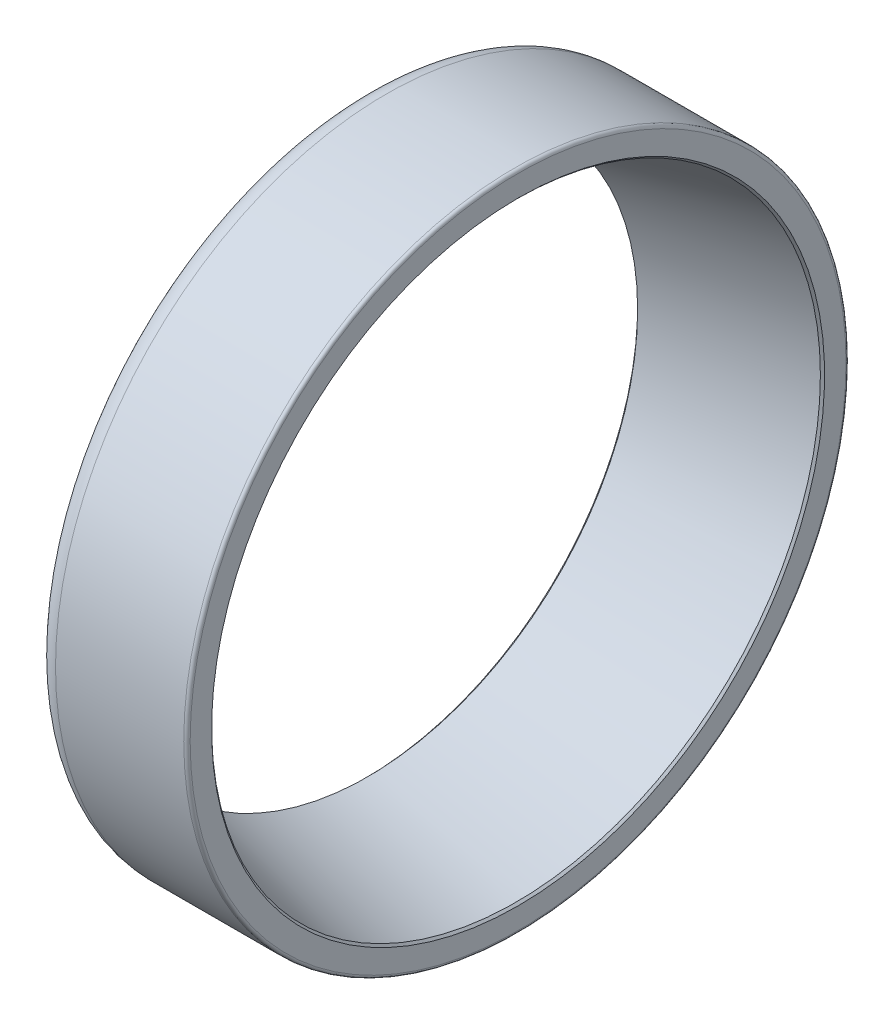
ISO-10303-21;
HEADER;
FILE_DESCRIPTION(('STEP AP214'),'2;1');
FILE_NAME('part.step','',(''),(''),'','','');
FILE_SCHEMA(('AUTOMOTIVE_DESIGN { 1 0 10303 214 1 1 1 1 }'));
ENDSEC;
DATA;
#1=APPLICATION_CONTEXT('core data for automotive mechanical design processes');
#2=APPLICATION_PROTOCOL_DEFINITION('international standard','automotive_design',2000,#1);
#3=PRODUCT_CONTEXT('',#1,'mechanical');
#4=PRODUCT('Part','Part','',(#3));
#5=PRODUCT_RELATED_PRODUCT_CATEGORY('part','',(#4));
#6=PRODUCT_DEFINITION_FORMATION('','',#4);
#7=PRODUCT_DEFINITION_CONTEXT('part definition',#1,'design');
#8=PRODUCT_DEFINITION('design','',#6,#7);
#9=PRODUCT_DEFINITION_SHAPE('','',#8);
#10=(LENGTH_UNIT() NAMED_UNIT(*) SI_UNIT(.MILLI.,.METRE.));
#11=(NAMED_UNIT(*) PLANE_ANGLE_UNIT() SI_UNIT($,.RADIAN.));
#12=(NAMED_UNIT(*) SI_UNIT($,.STERADIAN.) SOLID_ANGLE_UNIT());
#13=UNCERTAINTY_MEASURE_WITH_UNIT(LENGTH_MEASURE(1.E-05),#10,'distance_accuracy_value','');
#14=(GEOMETRIC_REPRESENTATION_CONTEXT(3) GLOBAL_UNCERTAINTY_ASSIGNED_CONTEXT((#13)) GLOBAL_UNIT_ASSIGNED_CONTEXT((#10,
#11,#12)) REPRESENTATION_CONTEXT('',''));
#15=CARTESIAN_POINT('',(0.,0.,0.));
#16=DIRECTION('',(0.,0.,1.));
#17=DIRECTION('',(1.,0.,0.));
#18=AXIS2_PLACEMENT_3D('',#15,#16,#17);
#19=CARTESIAN_POINT('',(14.2880000000003,4.44089209850063E-13,0.));
#20=DIRECTION('',(-1.,0.,0.));
#21=DIRECTION('',(0.,0.,1.));
#22=AXIS2_PLACEMENT_3D('',#19,#20,#21);
#23=CYLINDRICAL_SURFACE('',#22,30.956);
#24=CARTESIAN_POINT('',(1.99999999999978,-1.11022302462516E-13,0.));
#25=DIRECTION('',(-1.,0.,0.));
#26=DIRECTION('',(0.,0.,1.));
#27=AXIS2_PLACEMENT_3D('',#24,#25,#26);
#28=CIRCLE('',#27,30.956);
#29=CARTESIAN_POINT('',(1.99999999999977,-1.31643140832693E-13,30.956));
#30=VERTEX_POINT('',#29);
#31=EDGE_CURVE('E51',#30,#30,#28,.T.);
#32=ORIENTED_EDGE('',*,*,#31,.F.);
#33=EDGE_LOOP('',(#32));
#34=FACE_BOUND('',#33,.T.);
#35=CARTESIAN_POINT('',(13.9879999999998,0.,0.));
#36=DIRECTION('',(-1.,0.,0.));
#37=DIRECTION('',(0.,0.,1.));
#38=AXIS2_PLACEMENT_3D('',#35,#36,#37);
#39=CIRCLE('',#38,30.956);
#40=CARTESIAN_POINT('',(13.9879999999998,0.,30.956));
#41=VERTEX_POINT('',#40);
#42=EDGE_CURVE('E113',#41,#41,#39,.F.);
#43=ORIENTED_EDGE('',*,*,#42,.F.);
#44=EDGE_LOOP('',(#43));
#45=FACE_BOUND('',#44,.T.);
#46=ADVANCED_FACE('F17',(#34,#45),#23,.T.);
#47=CARTESIAN_POINT('',(13.9879999999998,0.,0.));
#48=DIRECTION('',(-1.,0.,0.));
#49=DIRECTION('',(0.,0.,1.));
#50=AXIS2_PLACEMENT_3D('',#47,#48,#49);
#51=TOROIDAL_SURFACE('',#50,30.656,0.29999999999988);
#52=ORIENTED_EDGE('',*,*,#42,.T.);
#53=EDGE_LOOP('',(#52));
#54=FACE_BOUND('',#53,.T.);
#55=CARTESIAN_POINT('',(14.2879999999996,0.,0.));
#56=DIRECTION('',(-1.,0.,0.));
#57=DIRECTION('',(0.,0.,1.));
#58=AXIS2_PLACEMENT_3D('',#55,#56,#57);
#59=CIRCLE('',#58,30.656);
#60=CARTESIAN_POINT('',(14.2879999999996,1.11022302462516E-13,30.656));
#61=VERTEX_POINT('',#60);
#62=CARTESIAN_POINT('',(14.288,0.,-30.6560000000005));
#63=VERTEX_POINT('',#62);
#64=EDGE_CURVE('E44',#61,#63,#59,.T.);
#65=ORIENTED_EDGE('',*,*,#64,.T.);
#66=CARTESIAN_POINT('',(14.2879999999996,0.,0.));
#67=DIRECTION('',(-1.,0.,0.));
#68=DIRECTION('',(0.,0.,-1.));
#69=AXIS2_PLACEMENT_3D('',#66,#67,#68);
#70=CIRCLE('',#69,30.656);
#71=EDGE_CURVE('E47',#63,#61,#70,.T.);
#72=ORIENTED_EDGE('',*,*,#71,.T.);
#73=EDGE_LOOP('',(#65,#72));
#74=FACE_BOUND('',#73,.T.);
#75=ADVANCED_FACE('F55',(#54,#74),#51,.T.);
#76=CARTESIAN_POINT('',(1.99999999999988,-1.11022302462516E-13,0.));
#77=DIRECTION('',(-1.,0.,0.));
#78=DIRECTION('',(0.,0.,1.));
#79=AXIS2_PLACEMENT_3D('',#76,#77,#78);
#80=TOROIDAL_SURFACE('',#79,28.956,2.00000000000017);
#81=CARTESIAN_POINT('',(-3.05745012640912E-13,-1.1230389124973E-13,0.));
#82=DIRECTION('',(1.,0.,0.));
#83=DIRECTION('',(0.,0.,1.));
#84=AXIS2_PLACEMENT_3D('',#81,#82,#83);
#85=CIRCLE('',#84,28.9560000000001);
#86=CARTESIAN_POINT('',(-3.33066907387547E-13,-1.11022302462516E-13,28.9559999999995));
#87=VERTEX_POINT('',#86);
#88=CARTESIAN_POINT('',(1.11022302462516E-13,-1.11022302462516E-13,-28.956));
#89=VERTEX_POINT('',#88);
#90=EDGE_CURVE('E56',#87,#89,#85,.T.);
#91=ORIENTED_EDGE('',*,*,#90,.T.);
#92=CARTESIAN_POINT('',(-3.10949183068843E-13,-1.1230389124973E-13,0.));
#93=DIRECTION('',(1.,0.,0.));
#94=DIRECTION('',(0.,0.,-1.));
#95=AXIS2_PLACEMENT_3D('',#92,#93,#94);
#96=CIRCLE('',#95,28.9560000000001);
#97=EDGE_CURVE('E35',#89,#87,#96,.T.);
#98=ORIENTED_EDGE('',*,*,#97,.T.);
#99=EDGE_LOOP('',(#91,#98));
#100=FACE_BOUND('',#99,.T.);
#101=ORIENTED_EDGE('',*,*,#31,.T.);
#102=EDGE_LOOP('',(#101));
#103=FACE_BOUND('',#102,.T.);
#104=ADVANCED_FACE('F72',(#100,#103),#80,.T.);
#105=CARTESIAN_POINT('',(14.2879999999997,28.652,0.));
#106=DIRECTION('',(-1.,0.,0.));
#107=DIRECTION('',(0.,0.,1.));
#108=AXIS2_PLACEMENT_3D('',#105,#106,#107);
#109=PLANE('',#108);
#110=CARTESIAN_POINT('',(14.2880000000003,4.44089209850063E-13,0.));
#111=DIRECTION('',(1.,0.,0.));
#112=DIRECTION('',(0.,1.,0.));
#113=AXIS2_PLACEMENT_3D('',#110,#111,#112);
#114=CIRCLE('',#113,28.652);
#115=CARTESIAN_POINT('',(14.2880000000003,28.6520000000005,0.));
#116=VERTEX_POINT('',#115);
#117=EDGE_CURVE('E97',#116,#116,#114,.F.);
#118=ORIENTED_EDGE('',*,*,#117,.T.);
#119=EDGE_LOOP('',(#118));
#120=FACE_BOUND('',#119,.T.);
#121=ORIENTED_EDGE('',*,*,#71,.F.);
#122=ORIENTED_EDGE('',*,*,#64,.F.);
#123=EDGE_LOOP('',(#121,#122));
#124=FACE_BOUND('',#123,.T.);
#125=ADVANCED_FACE('F49',(#120,#124),#109,.F.);
#126=CARTESIAN_POINT('',(-3.33066907387547E-13,28.9560000000004,0.));
#127=DIRECTION('',(1.,0.,0.));
#128=DIRECTION('',(0.,0.,-1.));
#129=AXIS2_PLACEMENT_3D('',#126,#127,#128);
#130=PLANE('',#129);
#131=ORIENTED_EDGE('',*,*,#90,.F.);
#132=ORIENTED_EDGE('',*,*,#97,.F.);
#133=EDGE_LOOP('',(#131,#132));
#134=FACE_BOUND('',#133,.T.);
#135=CARTESIAN_POINT('',(0.,0.,0.));
#136=DIRECTION('',(-1.,0.,0.));
#137=DIRECTION('',(0.,0.,1.));
#138=AXIS2_PLACEMENT_3D('',#135,#136,#137);
#139=CIRCLE('',#138,25.464);
#140=CARTESIAN_POINT('',(0.,0.,25.464));
#141=VERTEX_POINT('',#140);
#142=EDGE_CURVE('E99',#141,#141,#139,.F.);
#143=ORIENTED_EDGE('',*,*,#142,.T.);
#144=EDGE_LOOP('',(#143));
#145=FACE_BOUND('',#144,.T.);
#146=ADVANCED_FACE('F139',(#134,#145),#130,.F.);
#147=CARTESIAN_POINT('',(14.2880000000003,4.44089209850063E-13,0.));
#148=DIRECTION('',(1.,0.,0.));
#149=DIRECTION('',(0.,1.,0.));
#150=AXIS2_PLACEMENT_3D('',#147,#148,#149);
#151=CONICAL_SURFACE('',#150,28.652,0.785398163397453);
#152=ORIENTED_EDGE('',*,*,#117,.F.);
#153=EDGE_LOOP('',(#152));
#154=FACE_BOUND('',#153,.T.);
#155=CARTESIAN_POINT('',(14.092273972603,3.33066907387547E-13,-4.44089209850063E-13));
#156=DIRECTION('',(1.,0.,0.));
#157=DIRECTION('',(0.,0.,-1.));
#158=AXIS2_PLACEMENT_3D('',#155,#156,#157);
#159=CIRCLE('',#158,28.456273972603);
#160=CARTESIAN_POINT('',(14.0922739726031,3.55181874779145E-13,-28.4562739726035));
#161=VERTEX_POINT('',#160);
#162=EDGE_CURVE('E27',#161,#161,#159,.F.);
#163=ORIENTED_EDGE('',*,*,#162,.T.);
#164=EDGE_LOOP('',(#163));
#165=FACE_BOUND('',#164,.T.);
#166=ADVANCED_FACE('F132',(#154,#165),#151,.F.);
#167=CARTESIAN_POINT('',(0.,0.,0.));
#168=DIRECTION('',(-1.,0.,0.));
#169=DIRECTION('',(0.,0.,1.));
#170=AXIS2_PLACEMENT_3D('',#167,#168,#169);
#171=CONICAL_SURFACE('',#170,25.464,0.785398163396858);
#172=CARTESIAN_POINT('',(0.243186202201207,0.,0.));
#173=DIRECTION('',(1.,0.,0.));
#174=DIRECTION('',(0.,0.,-1.));
#175=AXIS2_PLACEMENT_3D('',#172,#173,#174);
#176=CIRCLE('',#175,25.220813797799);
#177=CARTESIAN_POINT('',(0.243186202201213,0.,-25.220813797799));
#178=VERTEX_POINT('',#177);
#179=EDGE_CURVE('E11',#178,#178,#176,.T.);
#180=ORIENTED_EDGE('',*,*,#179,.T.);
#181=EDGE_LOOP('',(#180));
#182=FACE_BOUND('',#181,.T.);
#183=ORIENTED_EDGE('',*,*,#142,.F.);
#184=EDGE_LOOP('',(#183));
#185=FACE_BOUND('',#184,.T.);
#186=ADVANCED_FACE('F126',(#182,#185),#171,.F.);
#187=CARTESIAN_POINT('',(14.092273972603,3.33066907387547E-13,-4.44089209850063E-13));
#188=DIRECTION('',(1.,0.,0.));
#189=DIRECTION('',(0.,0.,-1.));
#190=AXIS2_PLACEMENT_3D('',#187,#188,#189);
#191=CONICAL_SURFACE('',#190,28.456273972603,0.229506265911709);
#192=ORIENTED_EDGE('',*,*,#162,.F.);
#193=EDGE_LOOP('',(#192));
#194=FACE_BOUND('',#193,.T.);
#195=ORIENTED_EDGE('',*,*,#179,.F.);
#196=EDGE_LOOP('',(#195));
#197=FACE_BOUND('',#196,.T.);
#198=ADVANCED_FACE('F124',(#194,#197),#191,.F.);
#199=CLOSED_SHELL('',(#46,#75,#104,#125,#146,#166,#186,#198));
#200=MANIFOLD_SOLID_BREP('B1',#199);
#201=ADVANCED_BREP_SHAPE_REPRESENTATION('',(#18,#200),#14);
#202=SHAPE_DEFINITION_REPRESENTATION(#9,#201);
ENDSEC;
END-ISO-10303-21;
